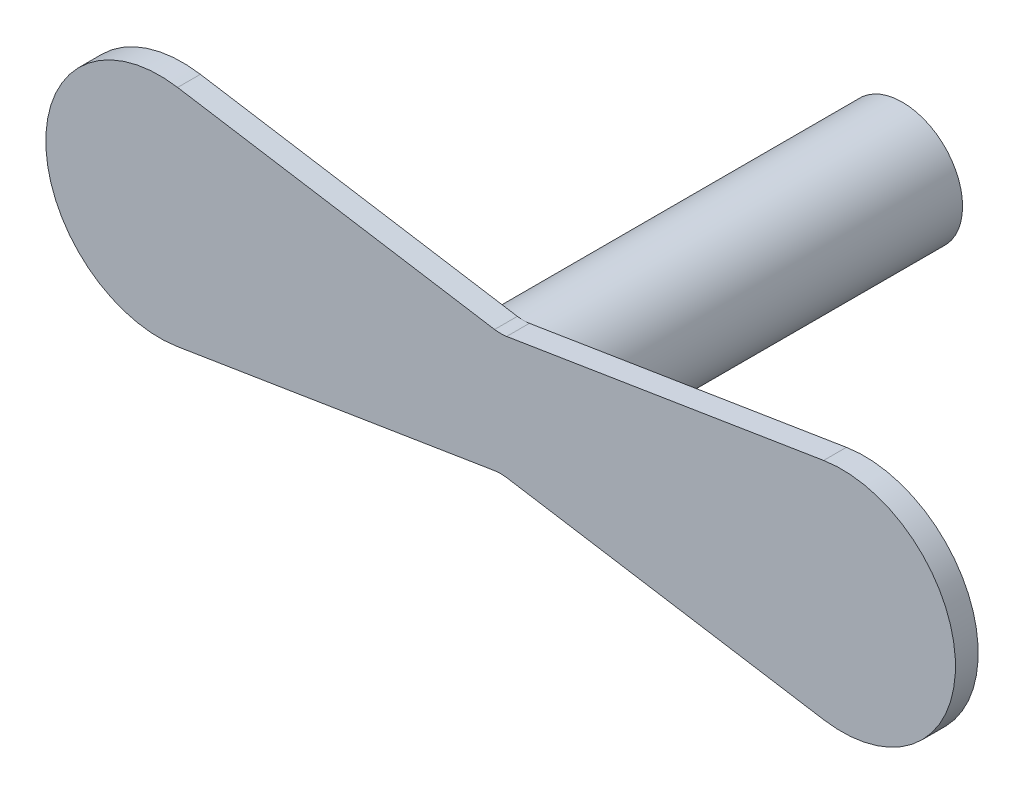
ISO-10303-21;
HEADER;
FILE_DESCRIPTION(('STEP AP214'),'2;1');
FILE_NAME('part.step','',(''),(''),'','','');
FILE_SCHEMA(('AUTOMOTIVE_DESIGN { 1 0 10303 214 1 1 1 1 }'));
ENDSEC;
DATA;
#1=APPLICATION_CONTEXT('core data for automotive mechanical design processes');
#2=APPLICATION_PROTOCOL_DEFINITION('international standard','automotive_design',2000,#1);
#3=PRODUCT_CONTEXT('',#1,'mechanical');
#4=PRODUCT('Part','Part','',(#3));
#5=PRODUCT_RELATED_PRODUCT_CATEGORY('part','',(#4));
#6=PRODUCT_DEFINITION_FORMATION('','',#4);
#7=PRODUCT_DEFINITION_CONTEXT('part definition',#1,'design');
#8=PRODUCT_DEFINITION('design','',#6,#7);
#9=PRODUCT_DEFINITION_SHAPE('','',#8);
#10=(LENGTH_UNIT() NAMED_UNIT(*) SI_UNIT(.MILLI.,.METRE.));
#11=(NAMED_UNIT(*) PLANE_ANGLE_UNIT() SI_UNIT($,.RADIAN.));
#12=(NAMED_UNIT(*) SI_UNIT($,.STERADIAN.) SOLID_ANGLE_UNIT());
#13=UNCERTAINTY_MEASURE_WITH_UNIT(LENGTH_MEASURE(1.E-05),#10,'distance_accuracy_value','');
#14=(GEOMETRIC_REPRESENTATION_CONTEXT(3) GLOBAL_UNCERTAINTY_ASSIGNED_CONTEXT((#13)) GLOBAL_UNIT_ASSIGNED_CONTEXT((#10,
#11,#12)) REPRESENTATION_CONTEXT('',''));
#15=CARTESIAN_POINT('',(0.,0.,0.));
#16=DIRECTION('',(0.,0.,1.));
#17=DIRECTION('',(1.,0.,0.));
#18=AXIS2_PLACEMENT_3D('',#15,#16,#17);
#19=CARTESIAN_POINT('',(0.,0.,50.));
#20=DIRECTION('',(0.,0.,-1.));
#21=DIRECTION('',(-1.,0.,0.));
#22=AXIS2_PLACEMENT_3D('',#19,#20,#21);
#23=CYLINDRICAL_SURFACE('',#22,7.9375);
#24=CARTESIAN_POINT('',(0.,0.,50.));
#25=DIRECTION('',(0.,0.,1.));
#26=DIRECTION('',(1.,0.,0.));
#27=AXIS2_PLACEMENT_3D('',#24,#25,#26);
#28=CIRCLE('',#27,7.9375);
#29=CARTESIAN_POINT('',(0.,7.9375,50.));
#30=VERTEX_POINT('',#29);
#31=CARTESIAN_POINT('',(0.,-7.9375,50.));
#32=VERTEX_POINT('',#31);
#33=EDGE_CURVE('E176',#30,#32,#28,.T.);
#34=ORIENTED_EDGE('',*,*,#33,.F.);
#35=EDGE_CURVE('E180',#32,#30,#28,.T.);
#36=ORIENTED_EDGE('',*,*,#35,.F.);
#37=EDGE_LOOP('',(#34,#36));
#38=FACE_BOUND('',#37,.T.);
#39=CARTESIAN_POINT('',(0.,0.,0.));
#40=DIRECTION('',(0.,0.,1.));
#41=DIRECTION('',(1.,0.,0.));
#42=AXIS2_PLACEMENT_3D('',#39,#40,#41);
#43=CIRCLE('',#42,7.9375);
#44=CARTESIAN_POINT('',(7.9375,0.,0.));
#45=VERTEX_POINT('',#44);
#46=EDGE_CURVE('E175',#45,#45,#43,.T.);
#47=ORIENTED_EDGE('',*,*,#46,.T.);
#48=EDGE_LOOP('',(#47));
#49=FACE_BOUND('',#48,.T.);
#50=ADVANCED_FACE('F39',(#38,#49),#23,.T.);
#51=CARTESIAN_POINT('',(0.,0.,0.));
#52=DIRECTION('',(0.,0.,1.));
#53=DIRECTION('',(1.,0.,0.));
#54=AXIS2_PLACEMENT_3D('',#51,#52,#53);
#55=PLANE('',#54);
#56=ORIENTED_EDGE('',*,*,#46,.F.);
#57=EDGE_LOOP('',(#56));
#58=FACE_BOUND('',#57,.T.);
#59=ADVANCED_FACE('F233',(#58),#55,.F.);
#60=CARTESIAN_POINT('',(45.,0.,53.));
#61=DIRECTION('',(0.,0.,-1.));
#62=DIRECTION('',(-1.,0.,0.));
#63=AXIS2_PLACEMENT_3D('',#60,#61,#62);
#64=CYLINDRICAL_SURFACE('',#63,15.);
#65=CARTESIAN_POINT('',(45.,0.,50.));
#66=DIRECTION('',(0.,0.,1.));
#67=DIRECTION('',(-1.,0.,0.));
#68=AXIS2_PLACEMENT_3D('',#65,#66,#67);
#69=CIRCLE('',#68,15.);
#70=CARTESIAN_POINT('',(42.6120919215055,-14.8087101061727,50.));
#71=VERTEX_POINT('',#70);
#72=CARTESIAN_POINT('',(42.6120919215054,14.8087101061727,50.));
#73=VERTEX_POINT('',#72);
#74=EDGE_CURVE('E129',#71,#73,#69,.T.);
#75=ORIENTED_EDGE('',*,*,#74,.T.);
#76=DIRECTION('',(0.,0.,-1.));
#77=VECTOR('',#76,1.);
#78=CARTESIAN_POINT('',(42.6120919215054,14.8087101061727,53.));
#79=LINE('',#78,#77);
#80=CARTESIAN_POINT('',(42.6120919215054,14.8087101061727,53.));
#81=VERTEX_POINT('',#80);
#82=EDGE_CURVE('E172',#81,#73,#79,.T.);
#83=ORIENTED_EDGE('',*,*,#82,.F.);
#84=CARTESIAN_POINT('',(45.,0.,53.));
#85=DIRECTION('',(0.,0.,1.));
#86=DIRECTION('',(-1.,0.,0.));
#87=AXIS2_PLACEMENT_3D('',#84,#85,#86);
#88=CIRCLE('',#87,15.);
#89=CARTESIAN_POINT('',(42.6120919215055,-14.8087101061727,53.));
#90=VERTEX_POINT('',#89);
#91=EDGE_CURVE('E150',#90,#81,#88,.T.);
#92=ORIENTED_EDGE('',*,*,#91,.F.);
#93=DIRECTION('',(0.,0.,-1.));
#94=VECTOR('',#93,1.);
#95=CARTESIAN_POINT('',(42.6120919215055,-14.8087101061727,53.));
#96=LINE('',#95,#94);
#97=EDGE_CURVE('E161',#90,#71,#96,.T.);
#98=ORIENTED_EDGE('',*,*,#97,.T.);
#99=EDGE_LOOP('',(#75,#83,#92,#98));
#100=FACE_BOUND('',#99,.T.);
#101=ADVANCED_FACE('F217',(#100),#64,.T.);
#102=CARTESIAN_POINT('',(0.,7.9375,53.));
#103=DIRECTION('',(0.159193871899637,-0.987247340411511,0.));
#104=DIRECTION('',(0.987247340411511,0.159193871899637,0.));
#105=AXIS2_PLACEMENT_3D('',#102,#103,#104);
#106=PLANE('',#105);
#107=DIRECTION('',(-0.987247340411511,-0.159193871899637,0.));
#108=VECTOR('',#107,1.);
#109=CARTESIAN_POINT('',(0.,7.9375,50.));
#110=LINE('',#109,#108);
#111=CARTESIAN_POINT('',(0.795969359498175,8.06585025131511,50.));
#112=VERTEX_POINT('',#111);
#113=EDGE_CURVE('E55',#73,#112,#110,.T.);
#114=ORIENTED_EDGE('',*,*,#113,.T.);
#115=DIRECTION('',(0.,0.,-1.));
#116=VECTOR('',#115,1.);
#117=CARTESIAN_POINT('',(0.795969359498175,8.06585025131511,53.));
#118=LINE('',#117,#116);
#119=CARTESIAN_POINT('',(0.795969359498175,8.06585025131511,53.));
#120=VERTEX_POINT('',#119);
#121=EDGE_CURVE('E193',#112,#120,#118,.F.);
#122=ORIENTED_EDGE('',*,*,#121,.T.);
#123=DIRECTION('',(-0.987247340411511,-0.159193871899637,0.));
#124=VECTOR('',#123,1.);
#125=CARTESIAN_POINT('',(0.,7.9375,53.));
#126=LINE('',#125,#124);
#127=EDGE_CURVE('E153',#81,#120,#126,.T.);
#128=ORIENTED_EDGE('',*,*,#127,.F.);
#129=ORIENTED_EDGE('',*,*,#82,.T.);
#130=EDGE_LOOP('',(#114,#122,#128,#129));
#131=FACE_BOUND('',#130,.T.);
#132=ADVANCED_FACE('F211',(#131),#106,.F.);
#133=CARTESIAN_POINT('',(0.,-7.9375,53.));
#134=DIRECTION('',(0.159193871899636,0.987247340411511,0.));
#135=DIRECTION('',(-0.987247340411511,0.159193871899636,0.));
#136=AXIS2_PLACEMENT_3D('',#133,#134,#135);
#137=PLANE('',#136);
#138=DIRECTION('',(0.987247340411511,-0.159193871899636,0.));
#139=VECTOR('',#138,1.);
#140=CARTESIAN_POINT('',(0.,-7.9375,53.));
#141=LINE('',#140,#139);
#142=CARTESIAN_POINT('',(0.795969359498185,-8.06585025131511,53.));
#143=VERTEX_POINT('',#142);
#144=EDGE_CURVE('E158',#143,#90,#141,.T.);
#145=ORIENTED_EDGE('',*,*,#144,.F.);
#146=DIRECTION('',(0.,0.,-1.));
#147=VECTOR('',#146,1.);
#148=CARTESIAN_POINT('',(0.795969359498185,-8.06585025131511,53.));
#149=LINE('',#148,#147);
#150=CARTESIAN_POINT('',(0.795969359498185,-8.06585025131511,50.));
#151=VERTEX_POINT('',#150);
#152=EDGE_CURVE('E179',#143,#151,#149,.T.);
#153=ORIENTED_EDGE('',*,*,#152,.T.);
#154=DIRECTION('',(0.987247340411511,-0.159193871899636,0.));
#155=VECTOR('',#154,1.);
#156=CARTESIAN_POINT('',(0.,-7.9375,50.));
#157=LINE('',#156,#155);
#158=EDGE_CURVE('E154',#151,#71,#157,.T.);
#159=ORIENTED_EDGE('',*,*,#158,.T.);
#160=ORIENTED_EDGE('',*,*,#97,.F.);
#161=EDGE_LOOP('',(#145,#153,#159,#160));
#162=FACE_BOUND('',#161,.T.);
#163=ADVANCED_FACE('F219',(#162),#137,.F.);
#164=CARTESIAN_POINT('',(45.,0.,53.));
#165=DIRECTION('',(0.,0.,-1.));
#166=DIRECTION('',(-1.,0.,0.));
#167=AXIS2_PLACEMENT_3D('',#164,#165,#166);
#168=PLANE('',#167);
#169=ORIENTED_EDGE('',*,*,#91,.T.);
#170=ORIENTED_EDGE('',*,*,#127,.T.);
#171=CARTESIAN_POINT('',(0.,13.0020869533727,53.));
#172=DIRECTION('',(0.,0.,-1.));
#173=DIRECTION('',(-1.,0.,0.));
#174=AXIS2_PLACEMENT_3D('',#171,#172,#173);
#175=CIRCLE('',#174,5.);
#176=CARTESIAN_POINT('',(-0.795969359498191,8.06585025131511,53.));
#177=VERTEX_POINT('',#176);
#178=EDGE_CURVE('E11',#120,#177,#175,.T.);
#179=ORIENTED_EDGE('',*,*,#178,.T.);
#180=DIRECTION('',(0.987247340411511,-0.159193871899636,0.));
#181=VECTOR('',#180,1.);
#182=CARTESIAN_POINT('',(0.,7.9375,53.));
#183=LINE('',#182,#181);
#184=CARTESIAN_POINT('',(-42.6120919215055,14.8087101061727,53.));
#185=VERTEX_POINT('',#184);
#186=EDGE_CURVE('E119',#185,#177,#183,.T.);
#187=ORIENTED_EDGE('',*,*,#186,.F.);
#188=CARTESIAN_POINT('',(-45.,0.,53.));
#189=DIRECTION('',(0.,0.,-1.));
#190=DIRECTION('',(1.,0.,0.));
#191=AXIS2_PLACEMENT_3D('',#188,#189,#190);
#192=CIRCLE('',#191,15.);
#193=CARTESIAN_POINT('',(-42.6120919215054,-14.8087101061727,53.));
#194=VERTEX_POINT('',#193);
#195=EDGE_CURVE('E120',#194,#185,#192,.T.);
#196=ORIENTED_EDGE('',*,*,#195,.F.);
#197=DIRECTION('',(-0.987247340411511,-0.159193871899637,0.));
#198=VECTOR('',#197,1.);
#199=CARTESIAN_POINT('',(0.,-7.9375,53.));
#200=LINE('',#199,#198);
#201=CARTESIAN_POINT('',(-0.79596935949818,-8.06585025131511,53.));
#202=VERTEX_POINT('',#201);
#203=EDGE_CURVE('E108',#202,#194,#200,.T.);
#204=ORIENTED_EDGE('',*,*,#203,.F.);
#205=CARTESIAN_POINT('',(0.,-13.0020869533727,53.));
#206=DIRECTION('',(0.,0.,-1.));
#207=DIRECTION('',(-1.,0.,0.));
#208=AXIS2_PLACEMENT_3D('',#205,#206,#207);
#209=CIRCLE('',#208,5.);
#210=EDGE_CURVE('E199',#202,#143,#209,.T.);
#211=ORIENTED_EDGE('',*,*,#210,.T.);
#212=ORIENTED_EDGE('',*,*,#144,.T.);
#213=EDGE_LOOP('',(#169,#170,#179,#187,#196,#204,#211,#212));
#214=FACE_BOUND('',#213,.T.);
#215=ADVANCED_FACE('F133',(#214),#168,.F.);
#216=CARTESIAN_POINT('',(45.,0.,50.));
#217=DIRECTION('',(0.,0.,-1.));
#218=DIRECTION('',(-1.,0.,0.));
#219=AXIS2_PLACEMENT_3D('',#216,#217,#218);
#220=PLANE('',#219);
#221=ORIENTED_EDGE('',*,*,#35,.T.);
#222=ORIENTED_EDGE('',*,*,#33,.T.);
#223=EDGE_LOOP('',(#221,#222));
#224=FACE_BOUND('',#223,.T.);
#225=ORIENTED_EDGE('',*,*,#158,.F.);
#226=CARTESIAN_POINT('',(0.,-13.0020869533727,50.));
#227=DIRECTION('',(0.,0.,-1.));
#228=DIRECTION('',(-1.,0.,0.));
#229=AXIS2_PLACEMENT_3D('',#226,#227,#228);
#230=CIRCLE('',#229,5.);
#231=CARTESIAN_POINT('',(-0.79596935949818,-8.06585025131511,50.));
#232=VERTEX_POINT('',#231);
#233=EDGE_CURVE('E196',#151,#232,#230,.F.);
#234=ORIENTED_EDGE('',*,*,#233,.T.);
#235=DIRECTION('',(-0.987247340411511,-0.159193871899637,0.));
#236=VECTOR('',#235,1.);
#237=CARTESIAN_POINT('',(0.,-7.9375,50.));
#238=LINE('',#237,#236);
#239=CARTESIAN_POINT('',(-42.6120919215054,-14.8087101061727,50.));
#240=VERTEX_POINT('',#239);
#241=EDGE_CURVE('E63',#232,#240,#238,.T.);
#242=ORIENTED_EDGE('',*,*,#241,.T.);
#243=CARTESIAN_POINT('',(-45.,0.,50.));
#244=DIRECTION('',(0.,0.,-1.));
#245=DIRECTION('',(1.,0.,0.));
#246=AXIS2_PLACEMENT_3D('',#243,#244,#245);
#247=CIRCLE('',#246,15.);
#248=CARTESIAN_POINT('',(-42.6120919215055,14.8087101061727,50.));
#249=VERTEX_POINT('',#248);
#250=EDGE_CURVE('E127',#240,#249,#247,.T.);
#251=ORIENTED_EDGE('',*,*,#250,.T.);
#252=DIRECTION('',(0.987247340411511,-0.159193871899636,0.));
#253=VECTOR('',#252,1.);
#254=CARTESIAN_POINT('',(0.,7.9375,50.));
#255=LINE('',#254,#253);
#256=CARTESIAN_POINT('',(-0.795969359498191,8.06585025131511,50.));
#257=VERTEX_POINT('',#256);
#258=EDGE_CURVE('E136',#249,#257,#255,.T.);
#259=ORIENTED_EDGE('',*,*,#258,.T.);
#260=CARTESIAN_POINT('',(0.,13.0020869533727,50.));
#261=DIRECTION('',(0.,0.,-1.));
#262=DIRECTION('',(-1.,0.,0.));
#263=AXIS2_PLACEMENT_3D('',#260,#261,#262);
#264=CIRCLE('',#263,5.);
#265=EDGE_CURVE('E48',#257,#112,#264,.F.);
#266=ORIENTED_EDGE('',*,*,#265,.T.);
#267=ORIENTED_EDGE('',*,*,#113,.F.);
#268=ORIENTED_EDGE('',*,*,#74,.F.);
#269=EDGE_LOOP('',(#225,#234,#242,#251,#259,#266,#267,#268));
#270=FACE_BOUND('',#269,.T.);
#271=ADVANCED_FACE('F205',(#224,#270),#220,.T.);
#272=CARTESIAN_POINT('',(-45.,0.,53.));
#273=DIRECTION('',(0.,0.,-1.));
#274=DIRECTION('',(-1.,0.,0.));
#275=AXIS2_PLACEMENT_3D('',#272,#273,#274);
#276=CYLINDRICAL_SURFACE('',#275,15.);
#277=ORIENTED_EDGE('',*,*,#250,.F.);
#278=DIRECTION('',(0.,0.,-1.));
#279=VECTOR('',#278,1.);
#280=CARTESIAN_POINT('',(-42.6120919215054,-14.8087101061727,53.));
#281=LINE('',#280,#279);
#282=EDGE_CURVE('E111',#194,#240,#281,.T.);
#283=ORIENTED_EDGE('',*,*,#282,.F.);
#284=ORIENTED_EDGE('',*,*,#195,.T.);
#285=DIRECTION('',(0.,0.,-1.));
#286=VECTOR('',#285,1.);
#287=CARTESIAN_POINT('',(-42.6120919215055,14.8087101061727,53.));
#288=LINE('',#287,#286);
#289=EDGE_CURVE('E130',#185,#249,#288,.T.);
#290=ORIENTED_EDGE('',*,*,#289,.T.);
#291=EDGE_LOOP('',(#277,#283,#284,#290));
#292=FACE_BOUND('',#291,.T.);
#293=ADVANCED_FACE('F124',(#292),#276,.T.);
#294=CARTESIAN_POINT('',(0.,-7.9375,53.));
#295=DIRECTION('',(0.159193871899637,-0.987247340411511,0.));
#296=DIRECTION('',(0.987247340411511,0.159193871899637,0.));
#297=AXIS2_PLACEMENT_3D('',#294,#295,#296);
#298=PLANE('',#297);
#299=ORIENTED_EDGE('',*,*,#241,.F.);
#300=DIRECTION('',(0.,0.,-1.));
#301=VECTOR('',#300,1.);
#302=CARTESIAN_POINT('',(-0.79596935949818,-8.06585025131511,53.));
#303=LINE('',#302,#301);
#304=EDGE_CURVE('E114',#232,#202,#303,.F.);
#305=ORIENTED_EDGE('',*,*,#304,.T.);
#306=ORIENTED_EDGE('',*,*,#203,.T.);
#307=ORIENTED_EDGE('',*,*,#282,.T.);
#308=EDGE_LOOP('',(#299,#305,#306,#307));
#309=FACE_BOUND('',#308,.T.);
#310=ADVANCED_FACE('F110',(#309),#298,.T.);
#311=CARTESIAN_POINT('',(0.,7.9375,53.));
#312=DIRECTION('',(0.159193871899636,0.987247340411511,0.));
#313=DIRECTION('',(-0.987247340411511,0.159193871899636,0.));
#314=AXIS2_PLACEMENT_3D('',#311,#312,#313);
#315=PLANE('',#314);
#316=ORIENTED_EDGE('',*,*,#186,.T.);
#317=DIRECTION('',(0.,0.,-1.));
#318=VECTOR('',#317,1.);
#319=CARTESIAN_POINT('',(-0.79596935949819,8.06585025131511,53.));
#320=LINE('',#319,#318);
#321=EDGE_CURVE('E189',#177,#257,#320,.T.);
#322=ORIENTED_EDGE('',*,*,#321,.T.);
#323=ORIENTED_EDGE('',*,*,#258,.F.);
#324=ORIENTED_EDGE('',*,*,#289,.F.);
#325=EDGE_LOOP('',(#316,#322,#323,#324));
#326=FACE_BOUND('',#325,.T.);
#327=ADVANCED_FACE('F224',(#326),#315,.T.);
#328=CARTESIAN_POINT('',(0.,-13.0020869533727,53.));
#329=DIRECTION('',(0.,0.,-1.));
#330=DIRECTION('',(-1.,0.,0.));
#331=AXIS2_PLACEMENT_3D('',#328,#329,#330);
#332=CYLINDRICAL_SURFACE('',#331,5.);
#333=ORIENTED_EDGE('',*,*,#210,.F.);
#334=ORIENTED_EDGE('',*,*,#304,.F.);
#335=ORIENTED_EDGE('',*,*,#233,.F.);
#336=ORIENTED_EDGE('',*,*,#152,.F.);
#337=EDGE_LOOP('',(#333,#334,#335,#336));
#338=FACE_BOUND('',#337,.T.);
#339=ADVANCED_FACE('F222',(#338),#332,.F.);
#340=CARTESIAN_POINT('',(0.,13.0020869533727,53.));
#341=DIRECTION('',(0.,0.,-1.));
#342=DIRECTION('',(-1.,0.,0.));
#343=AXIS2_PLACEMENT_3D('',#340,#341,#342);
#344=CYLINDRICAL_SURFACE('',#343,5.);
#345=ORIENTED_EDGE('',*,*,#178,.F.);
#346=ORIENTED_EDGE('',*,*,#121,.F.);
#347=ORIENTED_EDGE('',*,*,#265,.F.);
#348=ORIENTED_EDGE('',*,*,#321,.F.);
#349=EDGE_LOOP('',(#345,#346,#347,#348));
#350=FACE_BOUND('',#349,.T.);
#351=ADVANCED_FACE('F41',(#350),#344,.F.);
#352=CLOSED_SHELL('',(#50,#59,#101,#132,#163,#215,#271,#293,#310,#327,#339,#351));
#353=MANIFOLD_SOLID_BREP('B2',#352);
#354=ADVANCED_BREP_SHAPE_REPRESENTATION('',(#18,#353),#14);
#355=SHAPE_DEFINITION_REPRESENTATION(#9,#354);
ENDSEC;
END-ISO-10303-21;
